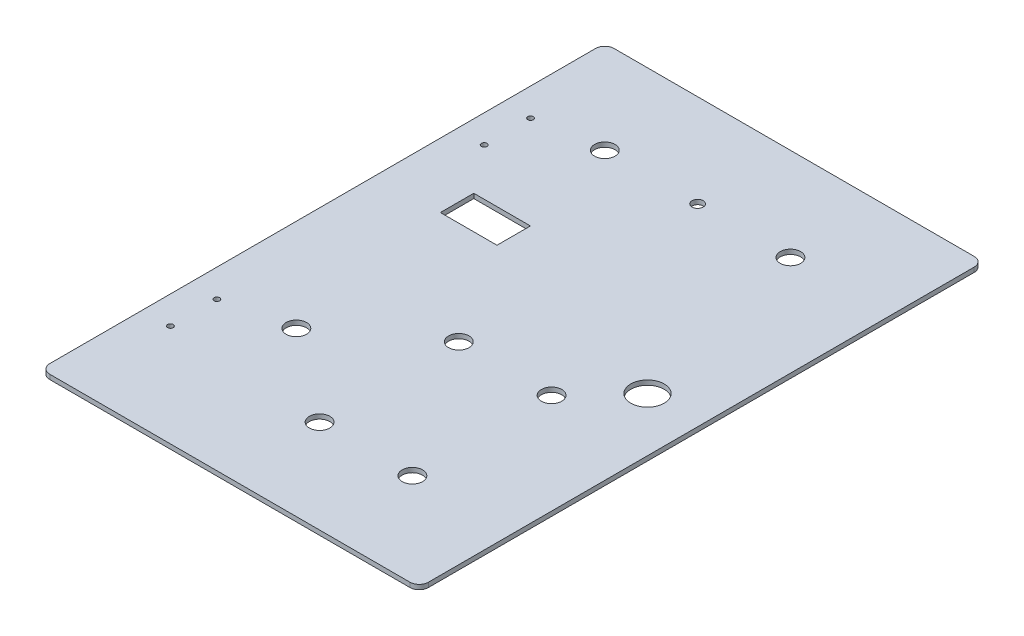
ISO-10303-21;
HEADER;
FILE_DESCRIPTION(('STEP AP214'),'2;1');
FILE_NAME('part.step','',(''),(''),'','','');
FILE_SCHEMA(('AUTOMOTIVE_DESIGN { 1 0 10303 214 1 1 1 1 }'));
ENDSEC;
DATA;
#1=APPLICATION_CONTEXT('core data for automotive mechanical design processes');
#2=APPLICATION_PROTOCOL_DEFINITION('international standard','automotive_design',2000,#1);
#3=PRODUCT_CONTEXT('',#1,'mechanical');
#4=PRODUCT('Part','Part','',(#3));
#5=PRODUCT_RELATED_PRODUCT_CATEGORY('part','',(#4));
#6=PRODUCT_DEFINITION_FORMATION('','',#4);
#7=PRODUCT_DEFINITION_CONTEXT('part definition',#1,'design');
#8=PRODUCT_DEFINITION('design','',#6,#7);
#9=PRODUCT_DEFINITION_SHAPE('','',#8);
#10=(LENGTH_UNIT() NAMED_UNIT(*) SI_UNIT(.MILLI.,.METRE.));
#11=(NAMED_UNIT(*) PLANE_ANGLE_UNIT() SI_UNIT($,.RADIAN.));
#12=(NAMED_UNIT(*) SI_UNIT($,.STERADIAN.) SOLID_ANGLE_UNIT());
#13=UNCERTAINTY_MEASURE_WITH_UNIT(LENGTH_MEASURE(1.E-05),#10,'distance_accuracy_value','');
#14=(GEOMETRIC_REPRESENTATION_CONTEXT(3) GLOBAL_UNCERTAINTY_ASSIGNED_CONTEXT((#13)) GLOBAL_UNIT_ASSIGNED_CONTEXT((#10,
#11,#12)) REPRESENTATION_CONTEXT('',''));
#15=CARTESIAN_POINT('',(0.,0.,0.));
#16=DIRECTION('',(0.,0.,1.));
#17=DIRECTION('',(1.,0.,0.));
#18=AXIS2_PLACEMENT_3D('',#15,#16,#17);
#19=CARTESIAN_POINT('',(-174.,21.8575553843535,-194.));
#20=DIRECTION('',(0.,-1.,0.));
#21=DIRECTION('',(0.,0.,-1.));
#22=AXIS2_PLACEMENT_3D('',#19,#20,#21);
#23=CYLINDRICAL_SURFACE('',#22,3.);
#24=CARTESIAN_POINT('',(-174.,0.,-194.));
#25=DIRECTION('',(0.,1.,0.));
#26=DIRECTION('',(0.,0.,-1.));
#27=AXIS2_PLACEMENT_3D('',#24,#25,#26);
#28=CIRCLE('',#27,3.);
#29=CARTESIAN_POINT('',(-174.,0.,-197.));
#30=VERTEX_POINT('',#29);
#31=EDGE_CURVE('E414',#30,#30,#28,.T.);
#32=ORIENTED_EDGE('',*,*,#31,.T.);
#33=EDGE_LOOP('',(#32));
#34=FACE_BOUND('',#33,.T.);
#35=CARTESIAN_POINT('',(-174.,-5.,-194.));
#36=DIRECTION('',(0.,1.,0.));
#37=DIRECTION('',(1.,0.,0.));
#38=AXIS2_PLACEMENT_3D('',#35,#36,#37);
#39=CIRCLE('',#38,3.);
#40=CARTESIAN_POINT('',(-171.,-5.,-194.));
#41=VERTEX_POINT('',#40);
#42=EDGE_CURVE('E321',#41,#41,#39,.T.);
#43=ORIENTED_EDGE('',*,*,#42,.F.);
#44=EDGE_LOOP('',(#43));
#45=FACE_BOUND('',#44,.T.);
#46=ADVANCED_FACE('F17',(#34,#45),#23,.F.);
#47=CARTESIAN_POINT('',(-174.,17.7716370301741,-144.));
#48=DIRECTION('',(0.,-1.,0.));
#49=DIRECTION('',(0.,0.,-1.));
#50=AXIS2_PLACEMENT_3D('',#47,#48,#49);
#51=CYLINDRICAL_SURFACE('',#50,3.);
#52=CARTESIAN_POINT('',(-174.,0.,-144.));
#53=DIRECTION('',(0.,1.,0.));
#54=DIRECTION('',(0.,0.,-1.));
#55=AXIS2_PLACEMENT_3D('',#52,#53,#54);
#56=CIRCLE('',#55,3.);
#57=CARTESIAN_POINT('',(-174.,0.,-147.));
#58=VERTEX_POINT('',#57);
#59=EDGE_CURVE('E350',#58,#58,#56,.T.);
#60=ORIENTED_EDGE('',*,*,#59,.T.);
#61=EDGE_LOOP('',(#60));
#62=FACE_BOUND('',#61,.T.);
#63=CARTESIAN_POINT('',(-174.,-5.,-144.));
#64=DIRECTION('',(0.,1.,0.));
#65=DIRECTION('',(1.,0.,0.));
#66=AXIS2_PLACEMENT_3D('',#63,#64,#65);
#67=CIRCLE('',#66,3.);
#68=CARTESIAN_POINT('',(-171.,-5.,-144.));
#69=VERTEX_POINT('',#68);
#70=EDGE_CURVE('E324',#69,#69,#67,.T.);
#71=ORIENTED_EDGE('',*,*,#70,.F.);
#72=EDGE_LOOP('',(#71));
#73=FACE_BOUND('',#72,.T.);
#74=ADVANCED_FACE('F493',(#62,#73),#51,.F.);
#75=CARTESIAN_POINT('',(-174.,96.9001691688442,144.));
#76=DIRECTION('',(0.,-1.,0.));
#77=DIRECTION('',(0.,0.,-1.));
#78=AXIS2_PLACEMENT_3D('',#75,#76,#77);
#79=CYLINDRICAL_SURFACE('',#78,3.);
#80=CARTESIAN_POINT('',(-174.,0.,144.));
#81=DIRECTION('',(0.,1.,0.));
#82=DIRECTION('',(0.,0.,-1.));
#83=AXIS2_PLACEMENT_3D('',#80,#81,#82);
#84=CIRCLE('',#83,3.);
#85=CARTESIAN_POINT('',(-174.,0.,141.));
#86=VERTEX_POINT('',#85);
#87=EDGE_CURVE('E293',#86,#86,#84,.T.);
#88=ORIENTED_EDGE('',*,*,#87,.T.);
#89=EDGE_LOOP('',(#88));
#90=FACE_BOUND('',#89,.T.);
#91=CARTESIAN_POINT('',(-174.,-5.,144.));
#92=DIRECTION('',(0.,1.,0.));
#93=DIRECTION('',(1.,0.,0.));
#94=AXIS2_PLACEMENT_3D('',#91,#92,#93);
#95=CIRCLE('',#94,3.);
#96=CARTESIAN_POINT('',(-171.,-5.,144.));
#97=VERTEX_POINT('',#96);
#98=EDGE_CURVE('E356',#97,#97,#95,.T.);
#99=ORIENTED_EDGE('',*,*,#98,.F.);
#100=EDGE_LOOP('',(#99));
#101=FACE_BOUND('',#100,.T.);
#102=ADVANCED_FACE('F498',(#90,#101),#79,.F.);
#103=CARTESIAN_POINT('',(-174.,80.1280073737051,194.));
#104=DIRECTION('',(0.,-1.,0.));
#105=DIRECTION('',(0.,0.,-1.));
#106=AXIS2_PLACEMENT_3D('',#103,#104,#105);
#107=CYLINDRICAL_SURFACE('',#106,3.);
#108=CARTESIAN_POINT('',(-174.,0.,194.));
#109=DIRECTION('',(0.,1.,0.));
#110=DIRECTION('',(0.,0.,-1.));
#111=AXIS2_PLACEMENT_3D('',#108,#109,#110);
#112=CIRCLE('',#111,3.);
#113=CARTESIAN_POINT('',(-174.,0.,191.));
#114=VERTEX_POINT('',#113);
#115=EDGE_CURVE('E289',#114,#114,#112,.T.);
#116=ORIENTED_EDGE('',*,*,#115,.T.);
#117=EDGE_LOOP('',(#116));
#118=FACE_BOUND('',#117,.T.);
#119=CARTESIAN_POINT('',(-174.,-5.,194.));
#120=DIRECTION('',(0.,1.,0.));
#121=DIRECTION('',(1.,0.,0.));
#122=AXIS2_PLACEMENT_3D('',#119,#120,#121);
#123=CIRCLE('',#122,3.);
#124=CARTESIAN_POINT('',(-171.,-5.,194.));
#125=VERTEX_POINT('',#124);
#126=EDGE_CURVE('E359',#125,#125,#123,.T.);
#127=ORIENTED_EDGE('',*,*,#126,.F.);
#128=EDGE_LOOP('',(#127));
#129=FACE_BOUND('',#128,.T.);
#130=ADVANCED_FACE('F569',(#118,#129),#107,.F.);
#131=CARTESIAN_POINT('',(-194.,-5.,294.));
#132=DIRECTION('',(0.,1.,0.));
#133=DIRECTION('',(0.,0.,1.));
#134=AXIS2_PLACEMENT_3D('',#131,#132,#133);
#135=CYLINDRICAL_SURFACE('',#134,10.);
#136=CARTESIAN_POINT('',(-194.,-5.,294.));
#137=DIRECTION('',(0.,-1.,0.));
#138=DIRECTION('',(0.,0.,-1.));
#139=AXIS2_PLACEMENT_3D('',#136,#137,#138);
#140=CIRCLE('',#139,10.);
#141=CARTESIAN_POINT('',(-194.,-5.,304.));
#142=VERTEX_POINT('',#141);
#143=CARTESIAN_POINT('',(-204.,-5.,294.));
#144=VERTEX_POINT('',#143);
#145=EDGE_CURVE('E254',#142,#144,#140,.T.);
#146=ORIENTED_EDGE('',*,*,#145,.F.);
#147=DIRECTION('',(0.,-1.,0.));
#148=VECTOR('',#147,1.);
#149=CARTESIAN_POINT('',(-194.,-5.,304.));
#150=LINE('',#149,#148);
#151=CARTESIAN_POINT('',(-194.,0.,304.));
#152=VERTEX_POINT('',#151);
#153=EDGE_CURVE('E277',#152,#142,#150,.T.);
#154=ORIENTED_EDGE('',*,*,#153,.F.);
#155=CARTESIAN_POINT('',(-194.,0.,294.));
#156=DIRECTION('',(0.,1.,0.));
#157=DIRECTION('',(0.,0.,-1.));
#158=AXIS2_PLACEMENT_3D('',#155,#156,#157);
#159=CIRCLE('',#158,10.);
#160=CARTESIAN_POINT('',(-204.,0.,294.));
#161=VERTEX_POINT('',#160);
#162=EDGE_CURVE('E442',#161,#152,#159,.T.);
#163=ORIENTED_EDGE('',*,*,#162,.F.);
#164=DIRECTION('',(0.,1.,0.));
#165=VECTOR('',#164,1.);
#166=CARTESIAN_POINT('',(-204.,-5.,294.));
#167=LINE('',#166,#165);
#168=EDGE_CURVE('E287',#144,#161,#167,.T.);
#169=ORIENTED_EDGE('',*,*,#168,.F.);
#170=EDGE_LOOP('',(#146,#154,#163,#169));
#171=FACE_BOUND('',#170,.T.);
#172=ADVANCED_FACE('F461',(#171),#135,.T.);
#173=CARTESIAN_POINT('',(194.,-5.,294.));
#174=DIRECTION('',(0.,1.,0.));
#175=DIRECTION('',(0.,0.,1.));
#176=AXIS2_PLACEMENT_3D('',#173,#174,#175);
#177=CYLINDRICAL_SURFACE('',#176,10.);
#178=CARTESIAN_POINT('',(194.,-5.,294.));
#179=DIRECTION('',(0.,-1.,0.));
#180=DIRECTION('',(0.,0.,-1.));
#181=AXIS2_PLACEMENT_3D('',#178,#179,#180);
#182=CIRCLE('',#181,10.);
#183=CARTESIAN_POINT('',(204.,-5.,294.));
#184=VERTEX_POINT('',#183);
#185=CARTESIAN_POINT('',(194.,-5.,304.));
#186=VERTEX_POINT('',#185);
#187=EDGE_CURVE('E411',#184,#186,#182,.T.);
#188=ORIENTED_EDGE('',*,*,#187,.F.);
#189=DIRECTION('',(0.,-1.,0.));
#190=VECTOR('',#189,1.);
#191=CARTESIAN_POINT('',(204.,-5.,294.));
#192=LINE('',#191,#190);
#193=CARTESIAN_POINT('',(204.,0.,294.));
#194=VERTEX_POINT('',#193);
#195=EDGE_CURVE('E310',#194,#184,#192,.T.);
#196=ORIENTED_EDGE('',*,*,#195,.F.);
#197=CARTESIAN_POINT('',(194.,0.,294.));
#198=DIRECTION('',(0.,1.,0.));
#199=DIRECTION('',(0.,0.,-1.));
#200=AXIS2_PLACEMENT_3D('',#197,#198,#199);
#201=CIRCLE('',#200,10.);
#202=CARTESIAN_POINT('',(194.,0.,304.));
#203=VERTEX_POINT('',#202);
#204=EDGE_CURVE('E445',#203,#194,#201,.T.);
#205=ORIENTED_EDGE('',*,*,#204,.F.);
#206=DIRECTION('',(0.,1.,0.));
#207=VECTOR('',#206,1.);
#208=CARTESIAN_POINT('',(194.,-5.,304.));
#209=LINE('',#208,#207);
#210=EDGE_CURVE('E306',#186,#203,#209,.T.);
#211=ORIENTED_EDGE('',*,*,#210,.F.);
#212=EDGE_LOOP('',(#188,#196,#205,#211));
#213=FACE_BOUND('',#212,.T.);
#214=ADVANCED_FACE('F472',(#213),#177,.T.);
#215=CARTESIAN_POINT('',(-194.,-5.,-294.));
#216=DIRECTION('',(0.,1.,0.));
#217=DIRECTION('',(0.,0.,1.));
#218=AXIS2_PLACEMENT_3D('',#215,#216,#217);
#219=CYLINDRICAL_SURFACE('',#218,10.);
#220=CARTESIAN_POINT('',(-194.,-5.,-294.));
#221=DIRECTION('',(0.,-1.,0.));
#222=DIRECTION('',(0.,0.,-1.));
#223=AXIS2_PLACEMENT_3D('',#220,#221,#222);
#224=CIRCLE('',#223,10.);
#225=CARTESIAN_POINT('',(-204.,-5.,-294.));
#226=VERTEX_POINT('',#225);
#227=CARTESIAN_POINT('',(-194.,-5.,-304.));
#228=VERTEX_POINT('',#227);
#229=EDGE_CURVE('E240',#226,#228,#224,.T.);
#230=ORIENTED_EDGE('',*,*,#229,.F.);
#231=DIRECTION('',(0.,-1.,0.));
#232=VECTOR('',#231,1.);
#233=CARTESIAN_POINT('',(-204.,-5.,-294.));
#234=LINE('',#233,#232);
#235=CARTESIAN_POINT('',(-204.,0.,-294.));
#236=VERTEX_POINT('',#235);
#237=EDGE_CURVE('E286',#236,#226,#234,.T.);
#238=ORIENTED_EDGE('',*,*,#237,.F.);
#239=CARTESIAN_POINT('',(-194.,0.,-294.));
#240=DIRECTION('',(0.,1.,0.));
#241=DIRECTION('',(0.,0.,-1.));
#242=AXIS2_PLACEMENT_3D('',#239,#240,#241);
#243=CIRCLE('',#242,10.);
#244=CARTESIAN_POINT('',(-194.,0.,-304.));
#245=VERTEX_POINT('',#244);
#246=EDGE_CURVE('E259',#245,#236,#243,.T.);
#247=ORIENTED_EDGE('',*,*,#246,.F.);
#248=DIRECTION('',(0.,1.,0.));
#249=VECTOR('',#248,1.);
#250=CARTESIAN_POINT('',(-194.,-5.,-304.));
#251=LINE('',#250,#249);
#252=EDGE_CURVE('E257',#228,#245,#251,.T.);
#253=ORIENTED_EDGE('',*,*,#252,.F.);
#254=EDGE_LOOP('',(#230,#238,#247,#253));
#255=FACE_BOUND('',#254,.T.);
#256=ADVANCED_FACE('F258',(#255),#219,.T.);
#257=CARTESIAN_POINT('',(194.,-5.,-294.));
#258=DIRECTION('',(0.,1.,0.));
#259=DIRECTION('',(0.,0.,1.));
#260=AXIS2_PLACEMENT_3D('',#257,#258,#259);
#261=CYLINDRICAL_SURFACE('',#260,10.);
#262=CARTESIAN_POINT('',(194.,-5.,-294.));
#263=DIRECTION('',(0.,-1.,0.));
#264=DIRECTION('',(0.,0.,-1.));
#265=AXIS2_PLACEMENT_3D('',#262,#263,#264);
#266=CIRCLE('',#265,10.);
#267=CARTESIAN_POINT('',(194.,-5.,-304.));
#268=VERTEX_POINT('',#267);
#269=CARTESIAN_POINT('',(204.,-5.,-294.));
#270=VERTEX_POINT('',#269);
#271=EDGE_CURVE('E253',#268,#270,#266,.T.);
#272=ORIENTED_EDGE('',*,*,#271,.F.);
#273=DIRECTION('',(0.,-1.,0.));
#274=VECTOR('',#273,1.);
#275=CARTESIAN_POINT('',(194.,-5.,-304.));
#276=LINE('',#275,#274);
#277=CARTESIAN_POINT('',(194.,0.,-304.));
#278=VERTEX_POINT('',#277);
#279=EDGE_CURVE('E269',#278,#268,#276,.T.);
#280=ORIENTED_EDGE('',*,*,#279,.F.);
#281=CARTESIAN_POINT('',(194.,0.,-294.));
#282=DIRECTION('',(0.,1.,0.));
#283=DIRECTION('',(0.,0.,-1.));
#284=AXIS2_PLACEMENT_3D('',#281,#282,#283);
#285=CIRCLE('',#284,10.);
#286=CARTESIAN_POINT('',(204.,0.,-294.));
#287=VERTEX_POINT('',#286);
#288=EDGE_CURVE('E448',#287,#278,#285,.T.);
#289=ORIENTED_EDGE('',*,*,#288,.F.);
#290=DIRECTION('',(0.,1.,0.));
#291=VECTOR('',#290,1.);
#292=CARTESIAN_POINT('',(204.,-5.,-294.));
#293=LINE('',#292,#291);
#294=EDGE_CURVE('E328',#270,#287,#293,.T.);
#295=ORIENTED_EDGE('',*,*,#294,.F.);
#296=EDGE_LOOP('',(#272,#280,#289,#295));
#297=FACE_BOUND('',#296,.T.);
#298=ADVANCED_FACE('F478',(#297),#261,.T.);
#299=CARTESIAN_POINT('',(-4.,21.6210946474568,-204.));
#300=DIRECTION('',(0.,-1.,0.));
#301=DIRECTION('',(0.,0.,-1.));
#302=AXIS2_PLACEMENT_3D('',#299,#300,#301);
#303=CYLINDRICAL_SURFACE('',#302,6.);
#304=CARTESIAN_POINT('',(-4.,0.,-204.));
#305=DIRECTION('',(0.,1.,0.));
#306=DIRECTION('',(0.,0.,-1.));
#307=AXIS2_PLACEMENT_3D('',#304,#305,#306);
#308=CIRCLE('',#307,6.);
#309=CARTESIAN_POINT('',(-4.,0.,-210.));
#310=VERTEX_POINT('',#309);
#311=EDGE_CURVE('E292',#310,#310,#308,.T.);
#312=ORIENTED_EDGE('',*,*,#311,.T.);
#313=EDGE_LOOP('',(#312));
#314=FACE_BOUND('',#313,.T.);
#315=CARTESIAN_POINT('',(-4.,-5.,-204.));
#316=DIRECTION('',(0.,1.,0.));
#317=DIRECTION('',(1.,0.,0.));
#318=AXIS2_PLACEMENT_3D('',#315,#316,#317);
#319=CIRCLE('',#318,6.);
#320=CARTESIAN_POINT('',(2.,-5.,-204.));
#321=VERTEX_POINT('',#320);
#322=EDGE_CURVE('E362',#321,#321,#319,.T.);
#323=ORIENTED_EDGE('',*,*,#322,.F.);
#324=EDGE_LOOP('',(#323));
#325=FACE_BOUND('',#324,.T.);
#326=ADVANCED_FACE('F480',(#314,#325),#303,.F.);
#327=CARTESIAN_POINT('',(146.,62.4678959301809,0.));
#328=DIRECTION('',(0.,-1.,0.));
#329=DIRECTION('',(0.,0.,-1.));
#330=AXIS2_PLACEMENT_3D('',#327,#328,#329);
#331=CYLINDRICAL_SURFACE('',#330,18.);
#332=CARTESIAN_POINT('',(146.,0.,0.));
#333=DIRECTION('',(0.,1.,0.));
#334=DIRECTION('',(0.,0.,-1.));
#335=AXIS2_PLACEMENT_3D('',#332,#333,#334);
#336=CIRCLE('',#335,18.);
#337=CARTESIAN_POINT('',(146.,0.,-18.));
#338=VERTEX_POINT('',#337);
#339=EDGE_CURVE('E378',#338,#338,#336,.T.);
#340=ORIENTED_EDGE('',*,*,#339,.T.);
#341=EDGE_LOOP('',(#340));
#342=FACE_BOUND('',#341,.T.);
#343=CARTESIAN_POINT('',(146.,-5.,0.));
#344=DIRECTION('',(0.,1.,0.));
#345=DIRECTION('',(1.,0.,0.));
#346=AXIS2_PLACEMENT_3D('',#343,#344,#345);
#347=CIRCLE('',#346,18.);
#348=CARTESIAN_POINT('',(164.,-5.,0.));
#349=VERTEX_POINT('',#348);
#350=EDGE_CURVE('E365',#349,#349,#347,.T.);
#351=ORIENTED_EDGE('',*,*,#350,.F.);
#352=EDGE_LOOP('',(#351));
#353=FACE_BOUND('',#352,.T.);
#354=ADVANCED_FACE('F487',(#342,#353),#331,.F.);
#355=CARTESIAN_POINT('',(96.,28.6663649179957,-204.));
#356=DIRECTION('',(0.,-1.,0.));
#357=DIRECTION('',(0.,0.,-1.));
#358=AXIS2_PLACEMENT_3D('',#355,#356,#357);
#359=CYLINDRICAL_SURFACE('',#358,11.);
#360=CARTESIAN_POINT('',(96.,0.,-204.));
#361=DIRECTION('',(0.,1.,0.));
#362=DIRECTION('',(0.,0.,-1.));
#363=AXIS2_PLACEMENT_3D('',#360,#361,#362);
#364=CIRCLE('',#363,11.);
#365=CARTESIAN_POINT('',(96.,0.,-215.));
#366=VERTEX_POINT('',#365);
#367=EDGE_CURVE('E373',#366,#366,#364,.T.);
#368=ORIENTED_EDGE('',*,*,#367,.T.);
#369=EDGE_LOOP('',(#368));
#370=FACE_BOUND('',#369,.T.);
#371=CARTESIAN_POINT('',(96.,-5.,-204.));
#372=DIRECTION('',(0.,1.,0.));
#373=DIRECTION('',(1.,0.,0.));
#374=AXIS2_PLACEMENT_3D('',#371,#372,#373);
#375=CIRCLE('',#374,11.);
#376=CARTESIAN_POINT('',(107.,-5.,-204.));
#377=VERTEX_POINT('',#376);
#378=EDGE_CURVE('E368',#377,#377,#375,.T.);
#379=ORIENTED_EDGE('',*,*,#378,.F.);
#380=EDGE_LOOP('',(#379));
#381=FACE_BOUND('',#380,.T.);
#382=ADVANCED_FACE('F546',(#370,#381),#359,.F.);
#383=CARTESIAN_POINT('',(-104.,55.4933006146598,-204.));
#384=DIRECTION('',(0.,-1.,0.));
#385=DIRECTION('',(0.,0.,-1.));
#386=AXIS2_PLACEMENT_3D('',#383,#384,#385);
#387=CYLINDRICAL_SURFACE('',#386,11.);
#388=CARTESIAN_POINT('',(-104.,0.,-204.));
#389=DIRECTION('',(0.,1.,0.));
#390=DIRECTION('',(0.,0.,-1.));
#391=AXIS2_PLACEMENT_3D('',#388,#389,#390);
#392=CIRCLE('',#391,11.);
#393=CARTESIAN_POINT('',(-104.,0.,-215.));
#394=VERTEX_POINT('',#393);
#395=EDGE_CURVE('E369',#394,#394,#392,.T.);
#396=ORIENTED_EDGE('',*,*,#395,.T.);
#397=EDGE_LOOP('',(#396));
#398=FACE_BOUND('',#397,.T.);
#399=CARTESIAN_POINT('',(-104.,-5.,-204.));
#400=DIRECTION('',(0.,1.,0.));
#401=DIRECTION('',(1.,0.,0.));
#402=AXIS2_PLACEMENT_3D('',#399,#400,#401);
#403=CIRCLE('',#402,11.);
#404=CARTESIAN_POINT('',(-93.,-5.,-204.));
#405=VERTEX_POINT('',#404);
#406=EDGE_CURVE('E282',#405,#405,#403,.T.);
#407=ORIENTED_EDGE('',*,*,#406,.F.);
#408=EDGE_LOOP('',(#407));
#409=FACE_BOUND('',#408,.T.);
#410=ADVANCED_FACE('F542',(#398,#409),#387,.F.);
#411=CARTESIAN_POINT('',(-104.,13.9804384099059,128.344438571223));
#412=DIRECTION('',(0.,-1.,0.));
#413=DIRECTION('',(0.,0.,-1.));
#414=AXIS2_PLACEMENT_3D('',#411,#412,#413);
#415=CYLINDRICAL_SURFACE('',#414,11.);
#416=CARTESIAN_POINT('',(-104.,0.,128.344438571223));
#417=DIRECTION('',(0.,1.,0.));
#418=DIRECTION('',(0.,0.,-1.));
#419=AXIS2_PLACEMENT_3D('',#416,#417,#418);
#420=CIRCLE('',#419,11.);
#421=CARTESIAN_POINT('',(-104.,0.,117.344438571223));
#422=VERTEX_POINT('',#421);
#423=EDGE_CURVE('E372',#422,#422,#420,.T.);
#424=ORIENTED_EDGE('',*,*,#423,.T.);
#425=EDGE_LOOP('',(#424));
#426=FACE_BOUND('',#425,.T.);
#427=CARTESIAN_POINT('',(-104.,-5.,128.344438571223));
#428=DIRECTION('',(0.,1.,0.));
#429=DIRECTION('',(1.,0.,0.));
#430=AXIS2_PLACEMENT_3D('',#427,#428,#429);
#431=CIRCLE('',#430,11.);
#432=CARTESIAN_POINT('',(-93.,-5.,128.344438571223));
#433=VERTEX_POINT('',#432);
#434=EDGE_CURVE('E278',#433,#433,#431,.T.);
#435=ORIENTED_EDGE('',*,*,#434,.F.);
#436=EDGE_LOOP('',(#435));
#437=FACE_BOUND('',#436,.T.);
#438=ADVANCED_FACE('F538',(#426,#437),#415,.F.);
#439=CARTESIAN_POINT('',(96.,29.0395615849271,53.3444385712235));
#440=DIRECTION('',(0.,-1.,0.));
#441=DIRECTION('',(0.,0.,-1.));
#442=AXIS2_PLACEMENT_3D('',#439,#440,#441);
#443=CYLINDRICAL_SURFACE('',#442,11.);
#444=CARTESIAN_POINT('',(96.,0.,53.3444385712235));
#445=DIRECTION('',(0.,1.,0.));
#446=DIRECTION('',(0.,0.,-1.));
#447=AXIS2_PLACEMENT_3D('',#444,#445,#446);
#448=CIRCLE('',#447,11.);
#449=CARTESIAN_POINT('',(96.,0.,42.3444385712235));
#450=VERTEX_POINT('',#449);
#451=EDGE_CURVE('E300',#450,#450,#448,.T.);
#452=ORIENTED_EDGE('',*,*,#451,.T.);
#453=EDGE_LOOP('',(#452));
#454=FACE_BOUND('',#453,.T.);
#455=CARTESIAN_POINT('',(96.,-5.,53.3444385712235));
#456=DIRECTION('',(0.,1.,0.));
#457=DIRECTION('',(-1.,0.,0.));
#458=AXIS2_PLACEMENT_3D('',#455,#456,#457);
#459=CIRCLE('',#458,11.);
#460=CARTESIAN_POINT('',(85.,-5.,53.3444385712235));
#461=VERTEX_POINT('',#460);
#462=EDGE_CURVE('E281',#461,#461,#459,.T.);
#463=ORIENTED_EDGE('',*,*,#462,.F.);
#464=EDGE_LOOP('',(#463));
#465=FACE_BOUND('',#464,.T.);
#466=ADVANCED_FACE('F524',(#454,#465),#443,.F.);
#467=CARTESIAN_POINT('',(-4.,98.1331984889527,53.3444385712235));
#468=DIRECTION('',(0.,-1.,0.));
#469=DIRECTION('',(0.,0.,-1.));
#470=AXIS2_PLACEMENT_3D('',#467,#468,#469);
#471=CYLINDRICAL_SURFACE('',#470,11.);
#472=CARTESIAN_POINT('',(-4.,0.,53.3444385712235));
#473=DIRECTION('',(0.,1.,0.));
#474=DIRECTION('',(0.,0.,-1.));
#475=AXIS2_PLACEMENT_3D('',#472,#473,#474);
#476=CIRCLE('',#475,11.);
#477=CARTESIAN_POINT('',(-4.,0.,42.3444385712235));
#478=VERTEX_POINT('',#477);
#479=EDGE_CURVE('E296',#478,#478,#476,.T.);
#480=ORIENTED_EDGE('',*,*,#479,.T.);
#481=EDGE_LOOP('',(#480));
#482=FACE_BOUND('',#481,.T.);
#483=CARTESIAN_POINT('',(-4.,-5.,53.3444385712235));
#484=DIRECTION('',(0.,1.,0.));
#485=DIRECTION('',(1.,0.,0.));
#486=AXIS2_PLACEMENT_3D('',#483,#484,#485);
#487=CIRCLE('',#486,11.);
#488=CARTESIAN_POINT('',(7.,-5.,53.3444385712235));
#489=VERTEX_POINT('',#488);
#490=EDGE_CURVE('E342',#489,#489,#487,.T.);
#491=ORIENTED_EDGE('',*,*,#490,.F.);
#492=EDGE_LOOP('',(#491));
#493=FACE_BOUND('',#492,.T.);
#494=ADVANCED_FACE('F521',(#482,#493),#471,.F.);
#495=CARTESIAN_POINT('',(96.,58.7076540386802,203.344438571223));
#496=DIRECTION('',(0.,-1.,0.));
#497=DIRECTION('',(0.,0.,-1.));
#498=AXIS2_PLACEMENT_3D('',#495,#496,#497);
#499=CYLINDRICAL_SURFACE('',#498,11.);
#500=CARTESIAN_POINT('',(96.,0.,203.344438571223));
#501=DIRECTION('',(0.,1.,0.));
#502=DIRECTION('',(0.,0.,-1.));
#503=AXIS2_PLACEMENT_3D('',#500,#501,#502);
#504=CIRCLE('',#503,11.);
#505=CARTESIAN_POINT('',(96.,0.,192.344438571223));
#506=VERTEX_POINT('',#505);
#507=EDGE_CURVE('E299',#506,#506,#504,.T.);
#508=ORIENTED_EDGE('',*,*,#507,.T.);
#509=EDGE_LOOP('',(#508));
#510=FACE_BOUND('',#509,.T.);
#511=CARTESIAN_POINT('',(96.,-5.,203.344438571223));
#512=DIRECTION('',(0.,1.,0.));
#513=DIRECTION('',(1.,0.,0.));
#514=AXIS2_PLACEMENT_3D('',#511,#512,#513);
#515=CIRCLE('',#514,11.);
#516=CARTESIAN_POINT('',(107.,-5.,203.344438571223));
#517=VERTEX_POINT('',#516);
#518=EDGE_CURVE('E345',#517,#517,#515,.T.);
#519=ORIENTED_EDGE('',*,*,#518,.F.);
#520=EDGE_LOOP('',(#519));
#521=FACE_BOUND('',#520,.T.);
#522=ADVANCED_FACE('F518',(#510,#521),#499,.F.);
#523=CARTESIAN_POINT('',(-4.,71.844398148231,203.344438571223));
#524=DIRECTION('',(0.,-1.,0.));
#525=DIRECTION('',(0.,0.,-1.));
#526=AXIS2_PLACEMENT_3D('',#523,#524,#525);
#527=CYLINDRICAL_SURFACE('',#526,11.);
#528=CARTESIAN_POINT('',(-4.,0.,203.344438571223));
#529=DIRECTION('',(0.,1.,0.));
#530=DIRECTION('',(0.,0.,-1.));
#531=AXIS2_PLACEMENT_3D('',#528,#529,#530);
#532=CIRCLE('',#531,11.);
#533=CARTESIAN_POINT('',(-4.,0.,192.344438571223));
#534=VERTEX_POINT('',#533);
#535=EDGE_CURVE('E429',#534,#534,#532,.T.);
#536=ORIENTED_EDGE('',*,*,#535,.T.);
#537=EDGE_LOOP('',(#536));
#538=FACE_BOUND('',#537,.T.);
#539=CARTESIAN_POINT('',(-4.,-5.,203.344438571223));
#540=DIRECTION('',(0.,1.,0.));
#541=DIRECTION('',(1.,0.,0.));
#542=AXIS2_PLACEMENT_3D('',#539,#540,#541);
#543=CIRCLE('',#542,11.);
#544=CARTESIAN_POINT('',(7.,-5.,203.344438571223));
#545=VERTEX_POINT('',#544);
#546=EDGE_CURVE('E384',#545,#545,#543,.T.);
#547=ORIENTED_EDGE('',*,*,#546,.F.);
#548=EDGE_LOOP('',(#547));
#549=FACE_BOUND('',#548,.T.);
#550=ADVANCED_FACE('F515',(#538,#549),#527,.F.);
#551=CARTESIAN_POINT('',(-134.5,16.8564432523772,-93.3277807143883));
#552=DIRECTION('',(0.,0.,-1.));
#553=DIRECTION('',(-1.,0.,0.));
#554=AXIS2_PLACEMENT_3D('',#551,#552,#553);
#555=PLANE('',#554);
#556=DIRECTION('',(0.,-1.,0.));
#557=VECTOR('',#556,1.);
#558=CARTESIAN_POINT('',(-134.5,16.8564432523772,-93.3277807143883));
#559=LINE('',#558,#557);
#560=CARTESIAN_POINT('',(-134.5,0.,-93.3277807143883));
#561=VERTEX_POINT('',#560);
#562=CARTESIAN_POINT('',(-134.5,-5.,-93.3277807143883));
#563=VERTEX_POINT('',#562);
#564=EDGE_CURVE('E11',#561,#563,#559,.T.);
#565=ORIENTED_EDGE('',*,*,#564,.T.);
#566=DIRECTION('',(1.,0.,0.));
#567=VECTOR('',#566,1.);
#568=CARTESIAN_POINT('',(-134.5,-5.,-93.3277807143883));
#569=LINE('',#568,#567);
#570=CARTESIAN_POINT('',(-73.5,-5.,-93.3277807143883));
#571=VERTEX_POINT('',#570);
#572=EDGE_CURVE('E391',#563,#571,#569,.T.);
#573=ORIENTED_EDGE('',*,*,#572,.T.);
#574=DIRECTION('',(0.,-1.,0.));
#575=VECTOR('',#574,1.);
#576=CARTESIAN_POINT('',(-73.5,16.8564432523772,-93.3277807143883));
#577=LINE('',#576,#575);
#578=CARTESIAN_POINT('',(-73.5,0.,-93.3277807143883));
#579=VERTEX_POINT('',#578);
#580=EDGE_CURVE('E394',#579,#571,#577,.T.);
#581=ORIENTED_EDGE('',*,*,#580,.F.);
#582=DIRECTION('',(1.,0.,0.));
#583=VECTOR('',#582,1.);
#584=CARTESIAN_POINT('',(0.,0.,-93.3277807143883));
#585=LINE('',#584,#583);
#586=EDGE_CURVE('E320',#561,#579,#585,.T.);
#587=ORIENTED_EDGE('',*,*,#586,.F.);
#588=EDGE_LOOP('',(#565,#573,#581,#587));
#589=FACE_BOUND('',#588,.T.);
#590=ADVANCED_FACE('F517',(#589),#555,.F.);
#591=CARTESIAN_POINT('',(-134.5,16.8564432523772,-57.3277807143883));
#592=DIRECTION('',(-1.,0.,0.));
#593=DIRECTION('',(0.,0.,1.));
#594=AXIS2_PLACEMENT_3D('',#591,#592,#593);
#595=PLANE('',#594);
#596=DIRECTION('',(0.,-1.,0.));
#597=VECTOR('',#596,1.);
#598=CARTESIAN_POINT('',(-134.5,16.8564432523772,-57.3277807143883));
#599=LINE('',#598,#597);
#600=CARTESIAN_POINT('',(-134.5,0.,-57.3277807143883));
#601=VERTEX_POINT('',#600);
#602=CARTESIAN_POINT('',(-134.5,-5.,-57.3277807143883));
#603=VERTEX_POINT('',#602);
#604=EDGE_CURVE('E20',#601,#603,#599,.T.);
#605=ORIENTED_EDGE('',*,*,#604,.T.);
#606=DIRECTION('',(0.,0.,-1.));
#607=VECTOR('',#606,1.);
#608=CARTESIAN_POINT('',(-134.5,-5.,-57.3277807143883));
#609=LINE('',#608,#607);
#610=EDGE_CURVE('E398',#603,#563,#609,.T.);
#611=ORIENTED_EDGE('',*,*,#610,.T.);
#612=ORIENTED_EDGE('',*,*,#564,.F.);
#613=DIRECTION('',(0.,0.,-1.));
#614=VECTOR('',#613,1.);
#615=CARTESIAN_POINT('',(-134.5,0.,0.));
#616=LINE('',#615,#614);
#617=EDGE_CURVE('E438',#601,#561,#616,.T.);
#618=ORIENTED_EDGE('',*,*,#617,.F.);
#619=EDGE_LOOP('',(#605,#611,#612,#618));
#620=FACE_BOUND('',#619,.T.);
#621=ADVANCED_FACE('F529',(#620),#595,.F.);
#622=CARTESIAN_POINT('',(-104.,16.8564432523772,-57.3277807143883));
#623=DIRECTION('',(0.,0.,1.));
#624=DIRECTION('',(1.,0.,0.));
#625=AXIS2_PLACEMENT_3D('',#622,#623,#624);
#626=PLANE('',#625);
#627=DIRECTION('',(0.,-1.,0.));
#628=VECTOR('',#627,1.);
#629=CARTESIAN_POINT('',(-73.5,16.8564432523772,-57.3277807143883));
#630=LINE('',#629,#628);
#631=CARTESIAN_POINT('',(-73.5,0.,-57.3277807143883));
#632=VERTEX_POINT('',#631);
#633=CARTESIAN_POINT('',(-73.5,-5.,-57.3277807143883));
#634=VERTEX_POINT('',#633);
#635=EDGE_CURVE('E47',#632,#634,#630,.T.);
#636=ORIENTED_EDGE('',*,*,#635,.T.);
#637=DIRECTION('',(-1.,0.,0.));
#638=VECTOR('',#637,1.);
#639=CARTESIAN_POINT('',(-104.,-5.,-57.3277807143883));
#640=LINE('',#639,#638);
#641=EDGE_CURVE('E404',#634,#603,#640,.T.);
#642=ORIENTED_EDGE('',*,*,#641,.T.);
#643=ORIENTED_EDGE('',*,*,#604,.F.);
#644=DIRECTION('',(-1.,0.,0.));
#645=VECTOR('',#644,1.);
#646=CARTESIAN_POINT('',(0.,0.,-57.3277807143883));
#647=LINE('',#646,#645);
#648=EDGE_CURVE('E319',#632,#601,#647,.T.);
#649=ORIENTED_EDGE('',*,*,#648,.F.);
#650=EDGE_LOOP('',(#636,#642,#643,#649));
#651=FACE_BOUND('',#650,.T.);
#652=ADVANCED_FACE('F526',(#651),#626,.F.);
#653=CARTESIAN_POINT('',(-73.5,16.8564432523772,-93.3277807143883));
#654=DIRECTION('',(1.,0.,0.));
#655=DIRECTION('',(0.,1.,0.));
#656=AXIS2_PLACEMENT_3D('',#653,#654,#655);
#657=PLANE('',#656);
#658=ORIENTED_EDGE('',*,*,#580,.T.);
#659=DIRECTION('',(0.,0.,1.));
#660=VECTOR('',#659,1.);
#661=CARTESIAN_POINT('',(-73.5,-5.,-93.3277807143883));
#662=LINE('',#661,#660);
#663=EDGE_CURVE('E388',#571,#634,#662,.T.);
#664=ORIENTED_EDGE('',*,*,#663,.T.);
#665=ORIENTED_EDGE('',*,*,#635,.F.);
#666=DIRECTION('',(0.,0.,1.));
#667=VECTOR('',#666,1.);
#668=CARTESIAN_POINT('',(-73.5,0.,0.));
#669=LINE('',#668,#667);
#670=EDGE_CURVE('E315',#579,#632,#669,.T.);
#671=ORIENTED_EDGE('',*,*,#670,.F.);
#672=EDGE_LOOP('',(#658,#664,#665,#671));
#673=FACE_BOUND('',#672,.T.);
#674=ADVANCED_FACE('F511',(#673),#657,.F.);
#675=CARTESIAN_POINT('',(0.,0.,0.));
#676=DIRECTION('',(0.,-1.,0.));
#677=DIRECTION('',(0.,0.,-1.));
#678=AXIS2_PLACEMENT_3D('',#675,#676,#677);
#679=PLANE('',#678);
#680=DIRECTION('',(0.,0.,-1.));
#681=VECTOR('',#680,1.);
#682=CARTESIAN_POINT('',(-204.,0.,304.));
#683=LINE('',#682,#681);
#684=EDGE_CURVE('E283',#161,#236,#683,.T.);
#685=ORIENTED_EDGE('',*,*,#684,.F.);
#686=ORIENTED_EDGE('',*,*,#162,.T.);
#687=DIRECTION('',(-1.,0.,0.));
#688=VECTOR('',#687,1.);
#689=CARTESIAN_POINT('',(204.,0.,304.));
#690=LINE('',#689,#688);
#691=EDGE_CURVE('E335',#203,#152,#690,.T.);
#692=ORIENTED_EDGE('',*,*,#691,.F.);
#693=ORIENTED_EDGE('',*,*,#204,.T.);
#694=DIRECTION('',(0.,0.,1.));
#695=VECTOR('',#694,1.);
#696=CARTESIAN_POINT('',(204.,0.,-304.));
#697=LINE('',#696,#695);
#698=EDGE_CURVE('E303',#287,#194,#697,.T.);
#699=ORIENTED_EDGE('',*,*,#698,.F.);
#700=ORIENTED_EDGE('',*,*,#288,.T.);
#701=DIRECTION('',(1.,0.,0.));
#702=VECTOR('',#701,1.);
#703=CARTESIAN_POINT('',(-204.,0.,-304.));
#704=LINE('',#703,#702);
#705=EDGE_CURVE('E264',#245,#278,#704,.T.);
#706=ORIENTED_EDGE('',*,*,#705,.F.);
#707=ORIENTED_EDGE('',*,*,#246,.T.);
#708=EDGE_LOOP('',(#685,#686,#692,#693,#699,#700,#706,#707));
#709=FACE_BOUND('',#708,.T.);
#710=ORIENTED_EDGE('',*,*,#586,.T.);
#711=ORIENTED_EDGE('',*,*,#670,.T.);
#712=ORIENTED_EDGE('',*,*,#648,.T.);
#713=ORIENTED_EDGE('',*,*,#617,.T.);
#714=EDGE_LOOP('',(#710,#711,#712,#713));
#715=FACE_BOUND('',#714,.T.);
#716=ORIENTED_EDGE('',*,*,#535,.F.);
#717=EDGE_LOOP('',(#716));
#718=FACE_BOUND('',#717,.T.);
#719=ORIENTED_EDGE('',*,*,#507,.F.);
#720=EDGE_LOOP('',(#719));
#721=FACE_BOUND('',#720,.T.);
#722=ORIENTED_EDGE('',*,*,#479,.F.);
#723=EDGE_LOOP('',(#722));
#724=FACE_BOUND('',#723,.T.);
#725=ORIENTED_EDGE('',*,*,#451,.F.);
#726=EDGE_LOOP('',(#725));
#727=FACE_BOUND('',#726,.T.);
#728=ORIENTED_EDGE('',*,*,#423,.F.);
#729=EDGE_LOOP('',(#728));
#730=FACE_BOUND('',#729,.T.);
#731=ORIENTED_EDGE('',*,*,#395,.F.);
#732=EDGE_LOOP('',(#731));
#733=FACE_BOUND('',#732,.T.);
#734=ORIENTED_EDGE('',*,*,#367,.F.);
#735=EDGE_LOOP('',(#734));
#736=FACE_BOUND('',#735,.T.);
#737=ORIENTED_EDGE('',*,*,#339,.F.);
#738=EDGE_LOOP('',(#737));
#739=FACE_BOUND('',#738,.T.);
#740=ORIENTED_EDGE('',*,*,#311,.F.);
#741=EDGE_LOOP('',(#740));
#742=FACE_BOUND('',#741,.T.);
#743=ORIENTED_EDGE('',*,*,#115,.F.);
#744=EDGE_LOOP('',(#743));
#745=FACE_BOUND('',#744,.T.);
#746=ORIENTED_EDGE('',*,*,#87,.F.);
#747=EDGE_LOOP('',(#746));
#748=FACE_BOUND('',#747,.T.);
#749=ORIENTED_EDGE('',*,*,#59,.F.);
#750=EDGE_LOOP('',(#749));
#751=FACE_BOUND('',#750,.T.);
#752=ORIENTED_EDGE('',*,*,#31,.F.);
#753=EDGE_LOOP('',(#752));
#754=FACE_BOUND('',#753,.T.);
#755=ADVANCED_FACE('F455',(#709,#715,#718,#721,#724,#727,#730,#733,#736,#739,#742,#745,#748,
#751,#754),#679,.F.);
#756=CARTESIAN_POINT('',(0.,-5.,0.));
#757=DIRECTION('',(0.,-1.,0.));
#758=DIRECTION('',(0.,0.,-1.));
#759=AXIS2_PLACEMENT_3D('',#756,#757,#758);
#760=PLANE('',#759);
#761=DIRECTION('',(-1.,0.,0.));
#762=VECTOR('',#761,1.);
#763=CARTESIAN_POINT('',(204.,-5.,304.));
#764=LINE('',#763,#762);
#765=EDGE_CURVE('E329',#186,#142,#764,.T.);
#766=ORIENTED_EDGE('',*,*,#765,.T.);
#767=ORIENTED_EDGE('',*,*,#145,.T.);
#768=DIRECTION('',(0.,0.,-1.));
#769=VECTOR('',#768,1.);
#770=CARTESIAN_POINT('',(-204.,-5.,304.));
#771=LINE('',#770,#769);
#772=EDGE_CURVE('E248',#144,#226,#771,.T.);
#773=ORIENTED_EDGE('',*,*,#772,.T.);
#774=ORIENTED_EDGE('',*,*,#229,.T.);
#775=DIRECTION('',(1.,0.,0.));
#776=VECTOR('',#775,1.);
#777=CARTESIAN_POINT('',(-204.,-5.,-304.));
#778=LINE('',#777,#776);
#779=EDGE_CURVE('E246',#228,#268,#778,.T.);
#780=ORIENTED_EDGE('',*,*,#779,.T.);
#781=ORIENTED_EDGE('',*,*,#271,.T.);
#782=DIRECTION('',(0.,0.,1.));
#783=VECTOR('',#782,1.);
#784=CARTESIAN_POINT('',(204.,-5.,-304.));
#785=LINE('',#784,#783);
#786=EDGE_CURVE('E314',#270,#184,#785,.T.);
#787=ORIENTED_EDGE('',*,*,#786,.T.);
#788=ORIENTED_EDGE('',*,*,#187,.T.);
#789=EDGE_LOOP('',(#766,#767,#773,#774,#780,#781,#787,#788));
#790=FACE_BOUND('',#789,.T.);
#791=ORIENTED_EDGE('',*,*,#663,.F.);
#792=ORIENTED_EDGE('',*,*,#572,.F.);
#793=ORIENTED_EDGE('',*,*,#610,.F.);
#794=ORIENTED_EDGE('',*,*,#641,.F.);
#795=EDGE_LOOP('',(#791,#792,#793,#794));
#796=FACE_BOUND('',#795,.T.);
#797=ORIENTED_EDGE('',*,*,#546,.T.);
#798=EDGE_LOOP('',(#797));
#799=FACE_BOUND('',#798,.T.);
#800=ORIENTED_EDGE('',*,*,#518,.T.);
#801=EDGE_LOOP('',(#800));
#802=FACE_BOUND('',#801,.T.);
#803=ORIENTED_EDGE('',*,*,#490,.T.);
#804=EDGE_LOOP('',(#803));
#805=FACE_BOUND('',#804,.T.);
#806=ORIENTED_EDGE('',*,*,#462,.T.);
#807=EDGE_LOOP('',(#806));
#808=FACE_BOUND('',#807,.T.);
#809=ORIENTED_EDGE('',*,*,#434,.T.);
#810=EDGE_LOOP('',(#809));
#811=FACE_BOUND('',#810,.T.);
#812=ORIENTED_EDGE('',*,*,#406,.T.);
#813=EDGE_LOOP('',(#812));
#814=FACE_BOUND('',#813,.T.);
#815=ORIENTED_EDGE('',*,*,#378,.T.);
#816=EDGE_LOOP('',(#815));
#817=FACE_BOUND('',#816,.T.);
#818=ORIENTED_EDGE('',*,*,#350,.T.);
#819=EDGE_LOOP('',(#818));
#820=FACE_BOUND('',#819,.T.);
#821=ORIENTED_EDGE('',*,*,#322,.T.);
#822=EDGE_LOOP('',(#821));
#823=FACE_BOUND('',#822,.T.);
#824=ORIENTED_EDGE('',*,*,#126,.T.);
#825=EDGE_LOOP('',(#824));
#826=FACE_BOUND('',#825,.T.);
#827=ORIENTED_EDGE('',*,*,#98,.T.);
#828=EDGE_LOOP('',(#827));
#829=FACE_BOUND('',#828,.T.);
#830=ORIENTED_EDGE('',*,*,#70,.T.);
#831=EDGE_LOOP('',(#830));
#832=FACE_BOUND('',#831,.T.);
#833=ORIENTED_EDGE('',*,*,#42,.T.);
#834=EDGE_LOOP('',(#833));
#835=FACE_BOUND('',#834,.T.);
#836=ADVANCED_FACE('F243',(#790,#796,#799,#802,#805,#808,#811,#814,#817,#820,#823,#826,#829,
#832,#835),#760,.T.);
#837=CARTESIAN_POINT('',(-204.,-5.,304.));
#838=DIRECTION('',(1.,0.,0.));
#839=DIRECTION('',(0.,1.,0.));
#840=AXIS2_PLACEMENT_3D('',#837,#838,#839);
#841=PLANE('',#840);
#842=ORIENTED_EDGE('',*,*,#772,.F.);
#843=ORIENTED_EDGE('',*,*,#168,.T.);
#844=ORIENTED_EDGE('',*,*,#684,.T.);
#845=ORIENTED_EDGE('',*,*,#237,.T.);
#846=EDGE_LOOP('',(#842,#843,#844,#845));
#847=FACE_BOUND('',#846,.T.);
#848=ADVANCED_FACE('F458',(#847),#841,.F.);
#849=CARTESIAN_POINT('',(204.,-5.,304.));
#850=DIRECTION('',(0.,0.,-1.));
#851=DIRECTION('',(0.,-1.,0.));
#852=AXIS2_PLACEMENT_3D('',#849,#850,#851);
#853=PLANE('',#852);
#854=ORIENTED_EDGE('',*,*,#691,.T.);
#855=ORIENTED_EDGE('',*,*,#153,.T.);
#856=ORIENTED_EDGE('',*,*,#765,.F.);
#857=ORIENTED_EDGE('',*,*,#210,.T.);
#858=EDGE_LOOP('',(#854,#855,#856,#857));
#859=FACE_BOUND('',#858,.T.);
#860=ADVANCED_FACE('F468',(#859),#853,.F.);
#861=CARTESIAN_POINT('',(204.,-5.,-304.));
#862=DIRECTION('',(-1.,0.,0.));
#863=DIRECTION('',(0.,0.,1.));
#864=AXIS2_PLACEMENT_3D('',#861,#862,#863);
#865=PLANE('',#864);
#866=ORIENTED_EDGE('',*,*,#698,.T.);
#867=ORIENTED_EDGE('',*,*,#195,.T.);
#868=ORIENTED_EDGE('',*,*,#786,.F.);
#869=ORIENTED_EDGE('',*,*,#294,.T.);
#870=EDGE_LOOP('',(#866,#867,#868,#869));
#871=FACE_BOUND('',#870,.T.);
#872=ADVANCED_FACE('F475',(#871),#865,.F.);
#873=CARTESIAN_POINT('',(-204.,-5.,-304.));
#874=DIRECTION('',(0.,0.,1.));
#875=DIRECTION('',(1.,0.,0.));
#876=AXIS2_PLACEMENT_3D('',#873,#874,#875);
#877=PLANE('',#876);
#878=ORIENTED_EDGE('',*,*,#779,.F.);
#879=ORIENTED_EDGE('',*,*,#252,.T.);
#880=ORIENTED_EDGE('',*,*,#705,.T.);
#881=ORIENTED_EDGE('',*,*,#279,.T.);
#882=EDGE_LOOP('',(#878,#879,#880,#881));
#883=FACE_BOUND('',#882,.T.);
#884=ADVANCED_FACE('F267',(#883),#877,.F.);
#885=CLOSED_SHELL('',(#46,#74,#102,#130,#172,#214,#256,#298,#326,#354,#382,#410,#438,#466,#494,
#522,#550,#590,#621,#652,#674,#755,#836,#848,#860,#872,#884));
#886=MANIFOLD_SOLID_BREP('B1',#885);
#887=ADVANCED_BREP_SHAPE_REPRESENTATION('',(#18,#886),#14);
#888=SHAPE_DEFINITION_REPRESENTATION(#9,#887);
ENDSEC;
END-ISO-10303-21;
